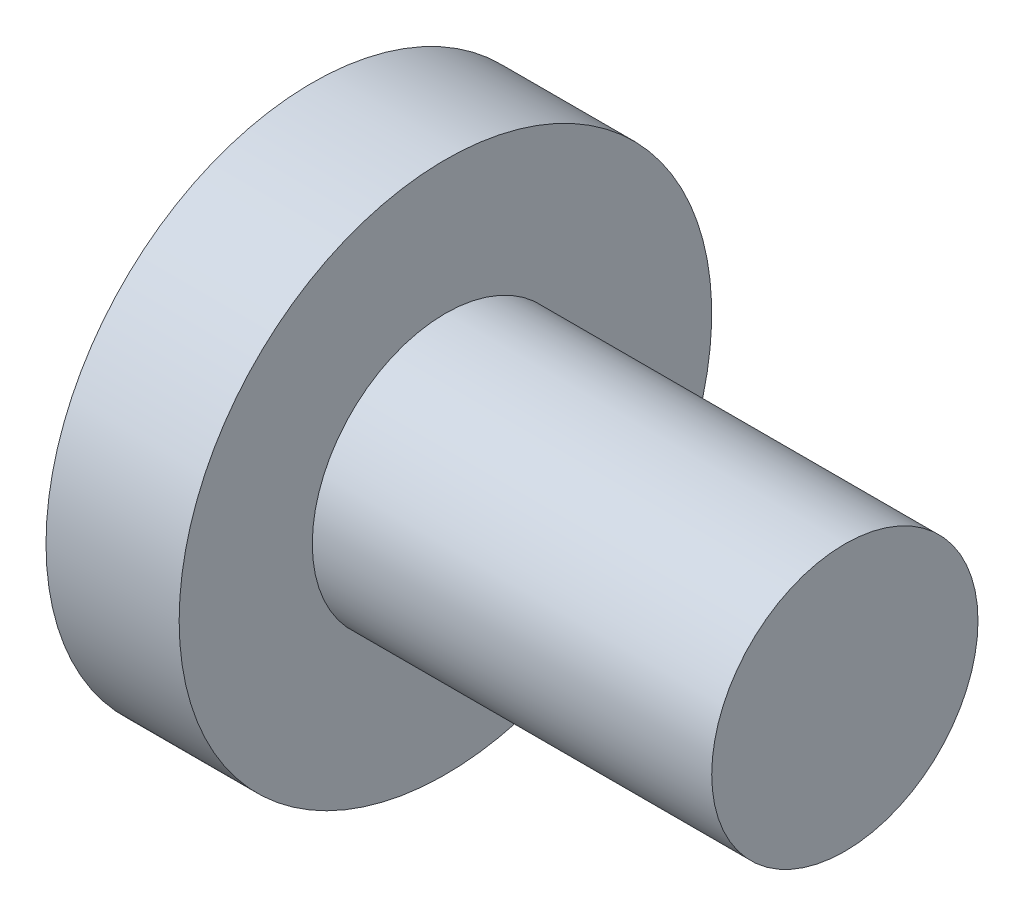
ISO-10303-21;
HEADER;
FILE_DESCRIPTION(('STEP AP214'),'2;1');
FILE_NAME('part.step','',(''),(''),'','','');
FILE_SCHEMA(('AUTOMOTIVE_DESIGN { 1 0 10303 214 1 1 1 1 }'));
ENDSEC;
DATA;
#1=APPLICATION_CONTEXT('core data for automotive mechanical design processes');
#2=APPLICATION_PROTOCOL_DEFINITION('international standard','automotive_design',2000,#1);
#3=PRODUCT_CONTEXT('',#1,'mechanical');
#4=PRODUCT('Part','Part','',(#3));
#5=PRODUCT_RELATED_PRODUCT_CATEGORY('part','',(#4));
#6=PRODUCT_DEFINITION_FORMATION('','',#4);
#7=PRODUCT_DEFINITION_CONTEXT('part definition',#1,'design');
#8=PRODUCT_DEFINITION('design','',#6,#7);
#9=PRODUCT_DEFINITION_SHAPE('','',#8);
#10=(LENGTH_UNIT() NAMED_UNIT(*) SI_UNIT(.MILLI.,.METRE.));
#11=(NAMED_UNIT(*) PLANE_ANGLE_UNIT() SI_UNIT($,.RADIAN.));
#12=(NAMED_UNIT(*) SI_UNIT($,.STERADIAN.) SOLID_ANGLE_UNIT());
#13=UNCERTAINTY_MEASURE_WITH_UNIT(LENGTH_MEASURE(1.E-05),#10,'distance_accuracy_value','');
#14=(GEOMETRIC_REPRESENTATION_CONTEXT(3) GLOBAL_UNCERTAINTY_ASSIGNED_CONTEXT((#13)) GLOBAL_UNIT_ASSIGNED_CONTEXT((#10,
#11,#12)) REPRESENTATION_CONTEXT('',''));
#15=CARTESIAN_POINT('',(0.,0.,0.));
#16=DIRECTION('',(0.,0.,1.));
#17=DIRECTION('',(1.,0.,0.));
#18=AXIS2_PLACEMENT_3D('',#15,#16,#17);
#19=CARTESIAN_POINT('',(-1.67814040103353,0.,-4.98055329374036));
#20=DIRECTION('',(-1.,0.,0.));
#21=DIRECTION('',(0.,0.,1.));
#22=AXIS2_PLACEMENT_3D('',#19,#20,#21);
#23=PLANE('',#22);
#24=CARTESIAN_POINT('',(-1.67814040103353,0.,5.01944670625964));
#25=DIRECTION('',(-1.,0.,0.));
#26=DIRECTION('',(0.,0.,1.));
#27=AXIS2_PLACEMENT_3D('',#24,#25,#26);
#28=CIRCLE('',#27,10.);
#29=CARTESIAN_POINT('',(-1.67814040103353,0.,15.0194467062596));
#30=VERTEX_POINT('',#29);
#31=EDGE_CURVE('E12',#30,#30,#28,.T.);
#32=ORIENTED_EDGE('',*,*,#31,.F.);
#33=EDGE_LOOP('',(#32));
#34=FACE_BOUND('',#33,.T.);
#35=CARTESIAN_POINT('',(-1.67814040103353,0.,5.01944670625964));
#36=DIRECTION('',(-1.,0.,0.));
#37=DIRECTION('',(0.,0.,1.));
#38=AXIS2_PLACEMENT_3D('',#35,#36,#37);
#39=CIRCLE('',#38,5.);
#40=CARTESIAN_POINT('',(-1.67814040103353,0.,10.0194467062596));
#41=VERTEX_POINT('',#40);
#42=EDGE_CURVE('E58',#41,#41,#39,.T.);
#43=ORIENTED_EDGE('',*,*,#42,.T.);
#44=EDGE_LOOP('',(#43));
#45=FACE_BOUND('',#44,.T.);
#46=ADVANCED_FACE('F44',(#34,#45),#23,.F.);
#47=CARTESIAN_POINT('',(-4.38000375507079,0.,5.01944670625964));
#48=DIRECTION('',(-1.,0.,0.));
#49=DIRECTION('',(0.,0.,1.));
#50=AXIS2_PLACEMENT_3D('',#47,#48,#49);
#51=CYLINDRICAL_SURFACE('',#50,10.);
#52=CARTESIAN_POINT('',(-6.67814040103353,0.,5.01944670625964));
#53=DIRECTION('',(-1.,0.,0.));
#54=DIRECTION('',(0.,0.,1.));
#55=AXIS2_PLACEMENT_3D('',#52,#53,#54);
#56=CIRCLE('',#55,10.);
#57=CARTESIAN_POINT('',(-6.67814040103353,0.,15.0194467062596));
#58=VERTEX_POINT('',#57);
#59=EDGE_CURVE('E50',#58,#58,#56,.T.);
#60=ORIENTED_EDGE('',*,*,#59,.F.);
#61=EDGE_LOOP('',(#60));
#62=FACE_BOUND('',#61,.T.);
#63=ORIENTED_EDGE('',*,*,#31,.T.);
#64=EDGE_LOOP('',(#63));
#65=FACE_BOUND('',#64,.T.);
#66=ADVANCED_FACE('F78',(#62,#65),#51,.T.);
#67=CARTESIAN_POINT('',(-6.67814040103353,0.,-4.98055329374036));
#68=DIRECTION('',(1.,0.,0.));
#69=DIRECTION('',(0.,0.,-1.));
#70=AXIS2_PLACEMENT_3D('',#67,#68,#69);
#71=PLANE('',#70);
#72=ORIENTED_EDGE('',*,*,#59,.T.);
#73=EDGE_LOOP('',(#72));
#74=FACE_BOUND('',#73,.T.);
#75=ADVANCED_FACE('F73',(#74),#71,.F.);
#76=CARTESIAN_POINT('',(13.3218595989665,0.,0.0194467062596369));
#77=DIRECTION('',(-1.,0.,0.));
#78=DIRECTION('',(0.,0.,1.));
#79=AXIS2_PLACEMENT_3D('',#76,#77,#78);
#80=PLANE('',#79);
#81=CARTESIAN_POINT('',(13.3218595989665,0.,5.01944670625964));
#82=DIRECTION('',(-1.,0.,0.));
#83=DIRECTION('',(0.,0.,1.));
#84=AXIS2_PLACEMENT_3D('',#81,#82,#83);
#85=CIRCLE('',#84,5.);
#86=CARTESIAN_POINT('',(13.3218595989665,0.,10.0194467062596));
#87=VERTEX_POINT('',#86);
#88=EDGE_CURVE('E54',#87,#87,#85,.T.);
#89=ORIENTED_EDGE('',*,*,#88,.F.);
#90=EDGE_LOOP('',(#89));
#91=FACE_BOUND('',#90,.T.);
#92=ADVANCED_FACE('F68',(#91),#80,.F.);
#93=CARTESIAN_POINT('',(-4.38000375507079,0.,5.01944670625964));
#94=DIRECTION('',(-1.,0.,0.));
#95=DIRECTION('',(0.,0.,1.));
#96=AXIS2_PLACEMENT_3D('',#93,#94,#95);
#97=CYLINDRICAL_SURFACE('',#96,5.);
#98=ORIENTED_EDGE('',*,*,#42,.F.);
#99=EDGE_LOOP('',(#98));
#100=FACE_BOUND('',#99,.T.);
#101=ORIENTED_EDGE('',*,*,#88,.T.);
#102=EDGE_LOOP('',(#101));
#103=FACE_BOUND('',#102,.T.);
#104=ADVANCED_FACE('F65',(#100,#103),#97,.T.);
#105=CLOSED_SHELL('',(#46,#66,#75,#92,#104));
#106=MANIFOLD_SOLID_BREP('B2',#105);
#107=ADVANCED_BREP_SHAPE_REPRESENTATION('',(#18,#106),#14);
#108=SHAPE_DEFINITION_REPRESENTATION(#9,#107);
ENDSEC;
END-ISO-10303-21;
